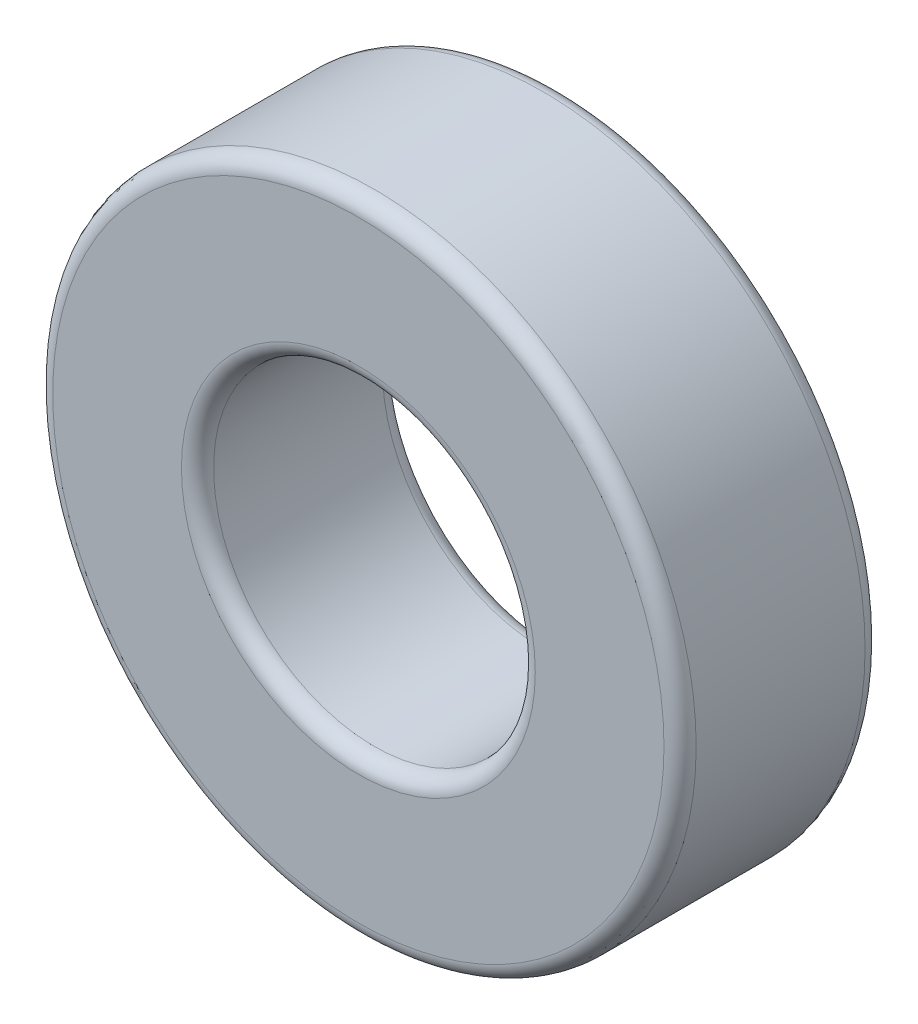
ISO-10303-21;
HEADER;
FILE_DESCRIPTION(('STEP AP214'),'2;1');
FILE_NAME('part.step','',(''),(''),'','','');
FILE_SCHEMA(('AUTOMOTIVE_DESIGN { 1 0 10303 214 1 1 1 1 }'));
ENDSEC;
DATA;
#1=APPLICATION_CONTEXT('core data for automotive mechanical design processes');
#2=APPLICATION_PROTOCOL_DEFINITION('international standard','automotive_design',2000,#1);
#3=PRODUCT_CONTEXT('',#1,'mechanical');
#4=PRODUCT('Part','Part','',(#3));
#5=PRODUCT_RELATED_PRODUCT_CATEGORY('part','',(#4));
#6=PRODUCT_DEFINITION_FORMATION('','',#4);
#7=PRODUCT_DEFINITION_CONTEXT('part definition',#1,'design');
#8=PRODUCT_DEFINITION('design','',#6,#7);
#9=PRODUCT_DEFINITION_SHAPE('','',#8);
#10=(LENGTH_UNIT() NAMED_UNIT(*) SI_UNIT(.MILLI.,.METRE.));
#11=(NAMED_UNIT(*) PLANE_ANGLE_UNIT() SI_UNIT($,.RADIAN.));
#12=(NAMED_UNIT(*) SI_UNIT($,.STERADIAN.) SOLID_ANGLE_UNIT());
#13=UNCERTAINTY_MEASURE_WITH_UNIT(LENGTH_MEASURE(1.E-05),#10,'distance_accuracy_value','');
#14=(GEOMETRIC_REPRESENTATION_CONTEXT(3) GLOBAL_UNCERTAINTY_ASSIGNED_CONTEXT((#13)) GLOBAL_UNIT_ASSIGNED_CONTEXT((#10,
#11,#12)) REPRESENTATION_CONTEXT('',''));
#15=CARTESIAN_POINT('',(0.,0.,0.));
#16=DIRECTION('',(0.,0.,1.));
#17=DIRECTION('',(1.,0.,0.));
#18=AXIS2_PLACEMENT_3D('',#15,#16,#17);
#19=CARTESIAN_POINT('',(0.,0.,2.5));
#20=DIRECTION('',(0.,0.,1.));
#21=DIRECTION('',(1.,0.,0.));
#22=AXIS2_PLACEMENT_3D('',#19,#20,#21);
#23=PLANE('',#22);
#24=CARTESIAN_POINT('',(0.,0.,2.5));
#25=DIRECTION('',(0.,0.,1.));
#26=DIRECTION('',(1.,0.,0.));
#27=AXIS2_PLACEMENT_3D('',#24,#25,#26);
#28=CIRCLE('',#27,3.8);
#29=CARTESIAN_POINT('',(3.8,0.,2.5));
#30=VERTEX_POINT('',#29);
#31=EDGE_CURVE('E44',#30,#30,#28,.T.);
#32=ORIENTED_EDGE('',*,*,#31,.T.);
#33=EDGE_LOOP('',(#32));
#34=FACE_BOUND('',#33,.T.);
#35=CARTESIAN_POINT('',(0.,0.,2.5));
#36=DIRECTION('',(0.,0.,1.));
#37=DIRECTION('',(1.,0.,0.));
#38=AXIS2_PLACEMENT_3D('',#35,#36,#37);
#39=CIRCLE('',#38,2.2);
#40=CARTESIAN_POINT('',(2.2,0.,2.5));
#41=VERTEX_POINT('',#40);
#42=EDGE_CURVE('E48',#41,#41,#39,.F.);
#43=ORIENTED_EDGE('',*,*,#42,.T.);
#44=EDGE_LOOP('',(#43));
#45=FACE_BOUND('',#44,.T.);
#46=ADVANCED_FACE('F33',(#34,#45),#23,.T.);
#47=CARTESIAN_POINT('',(0.,0.,0.));
#48=DIRECTION('',(0.,0.,1.));
#49=DIRECTION('',(1.,0.,0.));
#50=AXIS2_PLACEMENT_3D('',#47,#48,#49);
#51=PLANE('',#50);
#52=CARTESIAN_POINT('',(0.,0.,0.));
#53=DIRECTION('',(0.,0.,1.));
#54=DIRECTION('',(1.,0.,0.));
#55=AXIS2_PLACEMENT_3D('',#52,#53,#54);
#56=CIRCLE('',#55,3.8);
#57=CARTESIAN_POINT('',(3.8,0.,0.));
#58=VERTEX_POINT('',#57);
#59=EDGE_CURVE('E54',#58,#58,#56,.F.);
#60=ORIENTED_EDGE('',*,*,#59,.T.);
#61=EDGE_LOOP('',(#60));
#62=FACE_BOUND('',#61,.T.);
#63=CARTESIAN_POINT('',(0.,0.,0.));
#64=DIRECTION('',(0.,0.,1.));
#65=DIRECTION('',(1.,0.,0.));
#66=AXIS2_PLACEMENT_3D('',#63,#64,#65);
#67=CIRCLE('',#66,2.2);
#68=CARTESIAN_POINT('',(2.2,0.,0.));
#69=VERTEX_POINT('',#68);
#70=EDGE_CURVE('E57',#69,#69,#67,.T.);
#71=ORIENTED_EDGE('',*,*,#70,.T.);
#72=EDGE_LOOP('',(#71));
#73=FACE_BOUND('',#72,.T.);
#74=ADVANCED_FACE('F78',(#62,#73),#51,.F.);
#75=CARTESIAN_POINT('',(0.,0.,2.5));
#76=DIRECTION('',(0.,0.,-1.));
#77=DIRECTION('',(-1.,0.,0.));
#78=AXIS2_PLACEMENT_3D('',#75,#76,#77);
#79=CYLINDRICAL_SURFACE('',#78,4.);
#80=CARTESIAN_POINT('',(0.,0.,0.2));
#81=DIRECTION('',(0.,0.,1.));
#82=DIRECTION('',(1.,0.,0.));
#83=AXIS2_PLACEMENT_3D('',#80,#81,#82);
#84=CIRCLE('',#83,4.);
#85=CARTESIAN_POINT('',(4.,0.,0.2));
#86=VERTEX_POINT('',#85);
#87=EDGE_CURVE('E60',#86,#86,#84,.T.);
#88=ORIENTED_EDGE('',*,*,#87,.T.);
#89=EDGE_LOOP('',(#88));
#90=FACE_BOUND('',#89,.T.);
#91=CARTESIAN_POINT('',(0.,0.,2.3));
#92=DIRECTION('',(0.,0.,1.));
#93=DIRECTION('',(1.,0.,0.));
#94=AXIS2_PLACEMENT_3D('',#91,#92,#93);
#95=CIRCLE('',#94,4.);
#96=CARTESIAN_POINT('',(4.,0.,2.3));
#97=VERTEX_POINT('',#96);
#98=EDGE_CURVE('E63',#97,#97,#95,.F.);
#99=ORIENTED_EDGE('',*,*,#98,.T.);
#100=EDGE_LOOP('',(#99));
#101=FACE_BOUND('',#100,.T.);
#102=ADVANCED_FACE('F35',(#90,#101),#79,.T.);
#103=CARTESIAN_POINT('',(0.,0.,2.5));
#104=DIRECTION('',(0.,0.,-1.));
#105=DIRECTION('',(-1.,0.,0.));
#106=AXIS2_PLACEMENT_3D('',#103,#104,#105);
#107=CYLINDRICAL_SURFACE('',#106,2.);
#108=CARTESIAN_POINT('',(0.,0.,0.2));
#109=DIRECTION('',(0.,0.,1.));
#110=DIRECTION('',(1.,0.,0.));
#111=AXIS2_PLACEMENT_3D('',#108,#109,#110);
#112=CIRCLE('',#111,2.);
#113=CARTESIAN_POINT('',(2.,0.,0.2));
#114=VERTEX_POINT('',#113);
#115=EDGE_CURVE('E10',#114,#114,#112,.F.);
#116=ORIENTED_EDGE('',*,*,#115,.T.);
#117=EDGE_LOOP('',(#116));
#118=FACE_BOUND('',#117,.T.);
#119=CARTESIAN_POINT('',(0.,0.,2.3));
#120=DIRECTION('',(0.,0.,1.));
#121=DIRECTION('',(1.,0.,0.));
#122=AXIS2_PLACEMENT_3D('',#119,#120,#121);
#123=CIRCLE('',#122,2.);
#124=CARTESIAN_POINT('',(2.,0.,2.3));
#125=VERTEX_POINT('',#124);
#126=EDGE_CURVE('E40',#125,#125,#123,.T.);
#127=ORIENTED_EDGE('',*,*,#126,.T.);
#128=EDGE_LOOP('',(#127));
#129=FACE_BOUND('',#128,.T.);
#130=ADVANCED_FACE('F93',(#118,#129),#107,.F.);
#131=CARTESIAN_POINT('',(0.,0.,0.2));
#132=DIRECTION('',(0.,0.,1.));
#133=DIRECTION('',(1.,0.,0.));
#134=AXIS2_PLACEMENT_3D('',#131,#132,#133);
#135=TOROIDAL_SURFACE('',#134,3.8,0.2);
#136=ORIENTED_EDGE('',*,*,#59,.F.);
#137=EDGE_LOOP('',(#136));
#138=FACE_BOUND('',#137,.T.);
#139=ORIENTED_EDGE('',*,*,#87,.F.);
#140=EDGE_LOOP('',(#139));
#141=FACE_BOUND('',#140,.T.);
#142=ADVANCED_FACE('F72',(#138,#141),#135,.T.);
#143=CARTESIAN_POINT('',(0.,0.,2.3));
#144=DIRECTION('',(0.,0.,1.));
#145=DIRECTION('',(1.,0.,0.));
#146=AXIS2_PLACEMENT_3D('',#143,#144,#145);
#147=TOROIDAL_SURFACE('',#146,3.8,0.2);
#148=ORIENTED_EDGE('',*,*,#98,.F.);
#149=EDGE_LOOP('',(#148));
#150=FACE_BOUND('',#149,.T.);
#151=ORIENTED_EDGE('',*,*,#31,.F.);
#152=EDGE_LOOP('',(#151));
#153=FACE_BOUND('',#152,.T.);
#154=ADVANCED_FACE('F68',(#150,#153),#147,.T.);
#155=CARTESIAN_POINT('',(0.,0.,0.2));
#156=DIRECTION('',(0.,0.,1.));
#157=DIRECTION('',(1.,0.,0.));
#158=AXIS2_PLACEMENT_3D('',#155,#156,#157);
#159=TOROIDAL_SURFACE('',#158,2.2,0.2);
#160=ORIENTED_EDGE('',*,*,#115,.F.);
#161=EDGE_LOOP('',(#160));
#162=FACE_BOUND('',#161,.T.);
#163=ORIENTED_EDGE('',*,*,#70,.F.);
#164=EDGE_LOOP('',(#163));
#165=FACE_BOUND('',#164,.T.);
#166=ADVANCED_FACE('F71',(#162,#165),#159,.T.);
#167=CARTESIAN_POINT('',(0.,0.,2.3));
#168=DIRECTION('',(0.,0.,1.));
#169=DIRECTION('',(1.,0.,0.));
#170=AXIS2_PLACEMENT_3D('',#167,#168,#169);
#171=TOROIDAL_SURFACE('',#170,2.2,0.2);
#172=ORIENTED_EDGE('',*,*,#42,.F.);
#173=EDGE_LOOP('',(#172));
#174=FACE_BOUND('',#173,.T.);
#175=ORIENTED_EDGE('',*,*,#126,.F.);
#176=EDGE_LOOP('',(#175));
#177=FACE_BOUND('',#176,.T.);
#178=ADVANCED_FACE('F81',(#174,#177),#171,.T.);
#179=CLOSED_SHELL('',(#46,#74,#102,#130,#142,#154,#166,#178));
#180=MANIFOLD_SOLID_BREP('B2',#179);
#181=ADVANCED_BREP_SHAPE_REPRESENTATION('',(#18,#180),#14);
#182=SHAPE_DEFINITION_REPRESENTATION(#9,#181);
ENDSEC;
END-ISO-10303-21;
